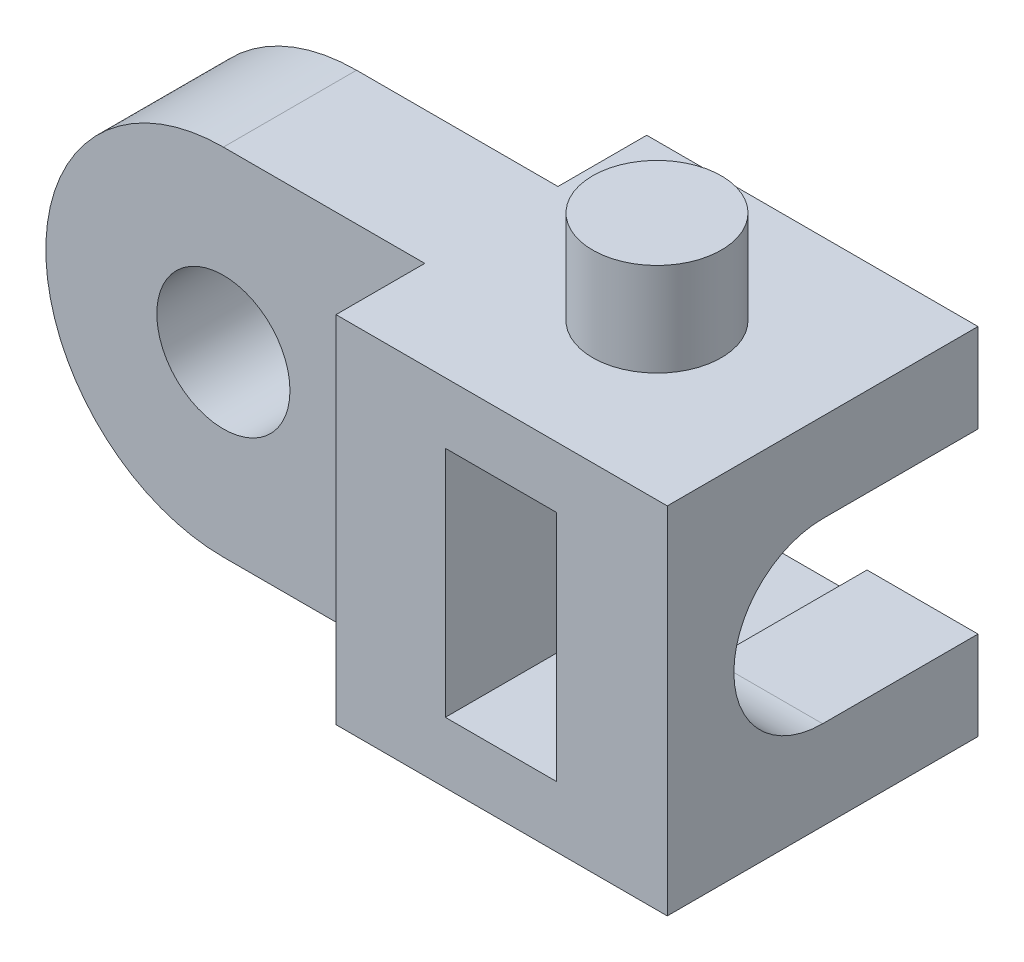
ISO-10303-21;
HEADER;
FILE_DESCRIPTION(('STEP AP214'),'2;1');
FILE_NAME('part.step','',(''),(''),'','','');
FILE_SCHEMA(('AUTOMOTIVE_DESIGN { 1 0 10303 214 1 1 1 1 }'));
ENDSEC;
DATA;
#1=APPLICATION_CONTEXT('core data for automotive mechanical design processes');
#2=APPLICATION_PROTOCOL_DEFINITION('international standard','automotive_design',2000,#1);
#3=PRODUCT_CONTEXT('',#1,'mechanical');
#4=PRODUCT('Part','Part','',(#3));
#5=PRODUCT_RELATED_PRODUCT_CATEGORY('part','',(#4));
#6=PRODUCT_DEFINITION_FORMATION('','',#4);
#7=PRODUCT_DEFINITION_CONTEXT('part definition',#1,'design');
#8=PRODUCT_DEFINITION('design','',#6,#7);
#9=PRODUCT_DEFINITION_SHAPE('','',#8);
#10=(LENGTH_UNIT() NAMED_UNIT(*) SI_UNIT(.MILLI.,.METRE.));
#11=(NAMED_UNIT(*) PLANE_ANGLE_UNIT() SI_UNIT($,.RADIAN.));
#12=(NAMED_UNIT(*) SI_UNIT($,.STERADIAN.) SOLID_ANGLE_UNIT());
#13=UNCERTAINTY_MEASURE_WITH_UNIT(LENGTH_MEASURE(1.E-05),#10,'distance_accuracy_value','');
#14=(GEOMETRIC_REPRESENTATION_CONTEXT(3) GLOBAL_UNCERTAINTY_ASSIGNED_CONTEXT((#13)) GLOBAL_UNIT_ASSIGNED_CONTEXT((#10,
#11,#12)) REPRESENTATION_CONTEXT('',''));
#15=CARTESIAN_POINT('',(0.,0.,0.));
#16=DIRECTION('',(0.,0.,1.));
#17=DIRECTION('',(1.,0.,0.));
#18=AXIS2_PLACEMENT_3D('',#15,#16,#17);
#19=CARTESIAN_POINT('',(0.,0.,-3.5));
#20=DIRECTION('',(0.,0.,1.));
#21=DIRECTION('',(1.,0.,0.));
#22=AXIS2_PLACEMENT_3D('',#19,#20,#21);
#23=PLANE('',#22);
#24=DIRECTION('',(0.,-1.,0.));
#25=VECTOR('',#24,1.);
#26=CARTESIAN_POINT('',(9.5,0.,-3.5));
#27=LINE('',#26,#25);
#28=CARTESIAN_POINT('',(9.5,-2.,-3.5));
#29=VERTEX_POINT('',#28);
#30=CARTESIAN_POINT('',(9.5,-2.625,-3.5));
#31=VERTEX_POINT('',#30);
#32=EDGE_CURVE('E265',#29,#31,#27,.T.);
#33=ORIENTED_EDGE('',*,*,#32,.F.);
#34=DIRECTION('',(-1.,0.,0.));
#35=VECTOR('',#34,1.);
#36=CARTESIAN_POINT('',(14.5,-2.,-3.5));
#37=LINE('',#36,#35);
#38=CARTESIAN_POINT('',(12.,-2.,-3.5));
#39=VERTEX_POINT('',#38);
#40=EDGE_CURVE('E167',#39,#29,#37,.T.);
#41=ORIENTED_EDGE('',*,*,#40,.F.);
#42=DIRECTION('',(0.,1.,0.));
#43=VECTOR('',#42,1.);
#44=CARTESIAN_POINT('',(12.,-4.,-3.5));
#45=LINE('',#44,#43);
#46=CARTESIAN_POINT('',(12.,-4.,-3.5));
#47=VERTEX_POINT('',#46);
#48=EDGE_CURVE('E251',#47,#39,#45,.T.);
#49=ORIENTED_EDGE('',*,*,#48,.F.);
#50=DIRECTION('',(1.,0.,0.));
#51=VECTOR('',#50,1.);
#52=CARTESIAN_POINT('',(12.,-4.,-3.5));
#53=LINE('',#52,#51);
#54=CARTESIAN_POINT('',(4.53690947743723,-4.,-3.5));
#55=VERTEX_POINT('',#54);
#56=EDGE_CURVE('E241',#55,#47,#53,.T.);
#57=ORIENTED_EDGE('',*,*,#56,.F.);
#58=DIRECTION('',(0.,-1.,0.));
#59=VECTOR('',#58,1.);
#60=CARTESIAN_POINT('',(4.53690947743723,-4.,-3.5));
#61=LINE('',#60,#59);
#62=CARTESIAN_POINT('',(4.53690947743723,4.,-3.5));
#63=VERTEX_POINT('',#62);
#64=EDGE_CURVE('E245',#63,#55,#61,.T.);
#65=ORIENTED_EDGE('',*,*,#64,.F.);
#66=DIRECTION('',(-1.,0.,0.));
#67=VECTOR('',#66,1.);
#68=CARTESIAN_POINT('',(12.,4.,-3.5));
#69=LINE('',#68,#67);
#70=CARTESIAN_POINT('',(12.,4.,-3.5));
#71=VERTEX_POINT('',#70);
#72=EDGE_CURVE('E248',#71,#63,#69,.T.);
#73=ORIENTED_EDGE('',*,*,#72,.F.);
#74=CARTESIAN_POINT('',(12.,2.,-3.5));
#75=VERTEX_POINT('',#74);
#76=EDGE_CURVE('E254',#75,#71,#45,.T.);
#77=ORIENTED_EDGE('',*,*,#76,.F.);
#78=DIRECTION('',(1.,0.,0.));
#79=VECTOR('',#78,1.);
#80=CARTESIAN_POINT('',(14.5,2.,-3.5));
#81=LINE('',#80,#79);
#82=CARTESIAN_POINT('',(9.5,2.,-3.5));
#83=VERTEX_POINT('',#82);
#84=EDGE_CURVE('E283',#83,#75,#81,.T.);
#85=ORIENTED_EDGE('',*,*,#84,.F.);
#86=CARTESIAN_POINT('',(9.5,2.625,-3.5));
#87=VERTEX_POINT('',#86);
#88=EDGE_CURVE('E176',#87,#83,#27,.T.);
#89=ORIENTED_EDGE('',*,*,#88,.F.);
#90=DIRECTION('',(1.,0.,0.));
#91=VECTOR('',#90,1.);
#92=CARTESIAN_POINT('',(0.,2.625,-3.5));
#93=LINE('',#92,#91);
#94=CARTESIAN_POINT('',(7.,2.625,-3.5));
#95=VERTEX_POINT('',#94);
#96=EDGE_CURVE('E266',#95,#87,#93,.T.);
#97=ORIENTED_EDGE('',*,*,#96,.F.);
#98=DIRECTION('',(0.,1.,0.));
#99=VECTOR('',#98,1.);
#100=CARTESIAN_POINT('',(7.,0.,-3.5));
#101=LINE('',#100,#99);
#102=CARTESIAN_POINT('',(7.,-2.625,-3.5));
#103=VERTEX_POINT('',#102);
#104=EDGE_CURVE('E268',#103,#95,#101,.T.);
#105=ORIENTED_EDGE('',*,*,#104,.F.);
#106=DIRECTION('',(-1.,0.,0.));
#107=VECTOR('',#106,1.);
#108=CARTESIAN_POINT('',(0.,-2.625,-3.5));
#109=LINE('',#108,#107);
#110=EDGE_CURVE('E270',#31,#103,#109,.T.);
#111=ORIENTED_EDGE('',*,*,#110,.F.);
#112=EDGE_LOOP('',(#33,#41,#49,#57,#65,#73,#77,#85,#89,#97,#105,#111));
#113=FACE_BOUND('',#112,.T.);
#114=ADVANCED_FACE('F49',(#113),#23,.F.);
#115=CARTESIAN_POINT('',(0.,0.,3.5));
#116=DIRECTION('',(0.,0.,1.));
#117=DIRECTION('',(1.,0.,0.));
#118=AXIS2_PLACEMENT_3D('',#115,#116,#117);
#119=PLANE('',#118);
#120=DIRECTION('',(0.,1.,0.));
#121=VECTOR('',#120,1.);
#122=CARTESIAN_POINT('',(12.,-4.,3.5));
#123=LINE('',#122,#121);
#124=CARTESIAN_POINT('',(12.,-4.,3.5));
#125=VERTEX_POINT('',#124);
#126=CARTESIAN_POINT('',(12.,4.,3.5));
#127=VERTEX_POINT('',#126);
#128=EDGE_CURVE('E244',#125,#127,#123,.T.);
#129=ORIENTED_EDGE('',*,*,#128,.T.);
#130=DIRECTION('',(-1.,0.,0.));
#131=VECTOR('',#130,1.);
#132=CARTESIAN_POINT('',(12.,4.,3.5));
#133=LINE('',#132,#131);
#134=CARTESIAN_POINT('',(4.53690947743723,4.,3.5));
#135=VERTEX_POINT('',#134);
#136=EDGE_CURVE('E260',#127,#135,#133,.T.);
#137=ORIENTED_EDGE('',*,*,#136,.T.);
#138=DIRECTION('',(0.,-1.,0.));
#139=VECTOR('',#138,1.);
#140=CARTESIAN_POINT('',(4.53690947743723,-4.,3.5));
#141=LINE('',#140,#139);
#142=CARTESIAN_POINT('',(4.53690947743723,-4.,3.5));
#143=VERTEX_POINT('',#142);
#144=EDGE_CURVE('E258',#135,#143,#141,.T.);
#145=ORIENTED_EDGE('',*,*,#144,.T.);
#146=DIRECTION('',(1.,0.,0.));
#147=VECTOR('',#146,1.);
#148=CARTESIAN_POINT('',(12.,-4.,3.5));
#149=LINE('',#148,#147);
#150=EDGE_CURVE('E255',#143,#125,#149,.T.);
#151=ORIENTED_EDGE('',*,*,#150,.T.);
#152=EDGE_LOOP('',(#129,#137,#145,#151));
#153=FACE_BOUND('',#152,.T.);
#154=DIRECTION('',(1.,0.,0.));
#155=VECTOR('',#154,1.);
#156=CARTESIAN_POINT('',(0.,2.625,3.5));
#157=LINE('',#156,#155);
#158=CARTESIAN_POINT('',(7.,2.625,3.5));
#159=VERTEX_POINT('',#158);
#160=CARTESIAN_POINT('',(9.5,2.625,3.5));
#161=VERTEX_POINT('',#160);
#162=EDGE_CURVE('E189',#159,#161,#157,.T.);
#163=ORIENTED_EDGE('',*,*,#162,.T.);
#164=DIRECTION('',(0.,-1.,0.));
#165=VECTOR('',#164,1.);
#166=CARTESIAN_POINT('',(9.5,0.,3.5));
#167=LINE('',#166,#165);
#168=CARTESIAN_POINT('',(9.5,-2.625,3.5));
#169=VERTEX_POINT('',#168);
#170=EDGE_CURVE('E57',#161,#169,#167,.T.);
#171=ORIENTED_EDGE('',*,*,#170,.T.);
#172=DIRECTION('',(-1.,0.,0.));
#173=VECTOR('',#172,1.);
#174=CARTESIAN_POINT('',(0.,-2.625,3.5));
#175=LINE('',#174,#173);
#176=CARTESIAN_POINT('',(7.,-2.625,3.5));
#177=VERTEX_POINT('',#176);
#178=EDGE_CURVE('E195',#169,#177,#175,.T.);
#179=ORIENTED_EDGE('',*,*,#178,.T.);
#180=DIRECTION('',(0.,1.,0.));
#181=VECTOR('',#180,1.);
#182=CARTESIAN_POINT('',(7.,0.,3.5));
#183=LINE('',#182,#181);
#184=EDGE_CURVE('E192',#177,#159,#183,.T.);
#185=ORIENTED_EDGE('',*,*,#184,.T.);
#186=EDGE_LOOP('',(#163,#171,#179,#185));
#187=FACE_BOUND('',#186,.T.);
#188=ADVANCED_FACE('F333',(#153,#187),#119,.T.);
#189=CARTESIAN_POINT('',(0.,0.,1.5));
#190=DIRECTION('',(0.,0.,1.));
#191=DIRECTION('',(1.,0.,0.));
#192=AXIS2_PLACEMENT_3D('',#189,#190,#191);
#193=PLANE('',#192);
#194=CARTESIAN_POINT('',(0.,0.,1.5));
#195=DIRECTION('',(0.,0.,1.));
#196=DIRECTION('',(1.,0.,0.));
#197=AXIS2_PLACEMENT_3D('',#194,#195,#196);
#198=CIRCLE('',#197,1.5);
#199=CARTESIAN_POINT('',(1.5,0.,1.5));
#200=VERTEX_POINT('',#199);
#201=EDGE_CURVE('E210',#200,#200,#198,.T.);
#202=ORIENTED_EDGE('',*,*,#201,.F.);
#203=EDGE_LOOP('',(#202));
#204=FACE_BOUND('',#203,.T.);
#205=DIRECTION('',(1.,0.,0.));
#206=VECTOR('',#205,1.);
#207=CARTESIAN_POINT('',(0.,-4.,1.5));
#208=LINE('',#207,#206);
#209=CARTESIAN_POINT('',(0.,-4.,1.5));
#210=VERTEX_POINT('',#209);
#211=CARTESIAN_POINT('',(4.53690947743723,-4.,1.5));
#212=VERTEX_POINT('',#211);
#213=EDGE_CURVE('E226',#210,#212,#208,.T.);
#214=ORIENTED_EDGE('',*,*,#213,.T.);
#215=DIRECTION('',(0.,1.,0.));
#216=VECTOR('',#215,1.);
#217=CARTESIAN_POINT('',(4.53690947743723,0.,1.5));
#218=LINE('',#217,#216);
#219=CARTESIAN_POINT('',(4.53690947743723,4.,1.5));
#220=VERTEX_POINT('',#219);
#221=EDGE_CURVE('E223',#212,#220,#218,.T.);
#222=ORIENTED_EDGE('',*,*,#221,.T.);
#223=DIRECTION('',(1.,0.,0.));
#224=VECTOR('',#223,1.);
#225=CARTESIAN_POINT('',(0.,4.,1.5));
#226=LINE('',#225,#224);
#227=CARTESIAN_POINT('',(0.,4.,1.5));
#228=VERTEX_POINT('',#227);
#229=EDGE_CURVE('E214',#228,#220,#226,.T.);
#230=ORIENTED_EDGE('',*,*,#229,.F.);
#231=CARTESIAN_POINT('',(0.,0.,1.5));
#232=DIRECTION('',(0.,0.,1.));
#233=DIRECTION('',(1.,0.,0.));
#234=AXIS2_PLACEMENT_3D('',#231,#232,#233);
#235=CIRCLE('',#234,4.);
#236=EDGE_CURVE('E228',#228,#210,#235,.T.);
#237=ORIENTED_EDGE('',*,*,#236,.T.);
#238=EDGE_LOOP('',(#214,#222,#230,#237));
#239=FACE_BOUND('',#238,.T.);
#240=ADVANCED_FACE('F324',(#204,#239),#193,.T.);
#241=CARTESIAN_POINT('',(0.,0.,-1.5));
#242=DIRECTION('',(0.,0.,1.));
#243=DIRECTION('',(1.,0.,0.));
#244=AXIS2_PLACEMENT_3D('',#241,#242,#243);
#245=PLANE('',#244);
#246=CARTESIAN_POINT('',(0.,0.,-1.5));
#247=DIRECTION('',(0.,0.,1.));
#248=DIRECTION('',(1.,0.,0.));
#249=AXIS2_PLACEMENT_3D('',#246,#247,#248);
#250=CIRCLE('',#249,1.5);
#251=CARTESIAN_POINT('',(1.5,0.,-1.5));
#252=VERTEX_POINT('',#251);
#253=EDGE_CURVE('E211',#252,#252,#250,.T.);
#254=ORIENTED_EDGE('',*,*,#253,.T.);
#255=EDGE_LOOP('',(#254));
#256=FACE_BOUND('',#255,.T.);
#257=DIRECTION('',(0.,1.,0.));
#258=VECTOR('',#257,1.);
#259=CARTESIAN_POINT('',(4.53690947743723,0.,-1.5));
#260=LINE('',#259,#258);
#261=CARTESIAN_POINT('',(4.53690947743723,-4.,-1.5));
#262=VERTEX_POINT('',#261);
#263=CARTESIAN_POINT('',(4.53690947743723,4.,-1.5));
#264=VERTEX_POINT('',#263);
#265=EDGE_CURVE('E198',#262,#264,#260,.T.);
#266=ORIENTED_EDGE('',*,*,#265,.F.);
#267=DIRECTION('',(1.,0.,0.));
#268=VECTOR('',#267,1.);
#269=CARTESIAN_POINT('',(0.,-4.,-1.5));
#270=LINE('',#269,#268);
#271=CARTESIAN_POINT('',(0.,-4.,-1.5));
#272=VERTEX_POINT('',#271);
#273=EDGE_CURVE('E215',#272,#262,#270,.T.);
#274=ORIENTED_EDGE('',*,*,#273,.F.);
#275=CARTESIAN_POINT('',(0.,0.,-1.5));
#276=DIRECTION('',(0.,0.,1.));
#277=DIRECTION('',(1.,0.,0.));
#278=AXIS2_PLACEMENT_3D('',#275,#276,#277);
#279=CIRCLE('',#278,4.);
#280=CARTESIAN_POINT('',(0.,4.,-1.5));
#281=VERTEX_POINT('',#280);
#282=EDGE_CURVE('E218',#281,#272,#279,.T.);
#283=ORIENTED_EDGE('',*,*,#282,.F.);
#284=DIRECTION('',(1.,0.,0.));
#285=VECTOR('',#284,1.);
#286=CARTESIAN_POINT('',(0.,4.,-1.5));
#287=LINE('',#286,#285);
#288=EDGE_CURVE('E220',#281,#264,#287,.T.);
#289=ORIENTED_EDGE('',*,*,#288,.T.);
#290=EDGE_LOOP('',(#266,#274,#283,#289));
#291=FACE_BOUND('',#290,.T.);
#292=ADVANCED_FACE('F304',(#256,#291),#245,.F.);
#293=CARTESIAN_POINT('',(0.,4.,1.5));
#294=DIRECTION('',(0.,1.,0.));
#295=DIRECTION('',(-1.,0.,0.));
#296=AXIS2_PLACEMENT_3D('',#293,#294,#295);
#297=PLANE('',#296);
#298=CARTESIAN_POINT('',(8.26845473871862,4.,0.));
#299=DIRECTION('',(0.,1.,0.));
#300=DIRECTION('',(-1.,0.,0.));
#301=AXIS2_PLACEMENT_3D('',#298,#299,#300);
#302=CIRCLE('',#301,1.45);
#303=CARTESIAN_POINT('',(6.81845473871862,4.,0.));
#304=VERTEX_POINT('',#303);
#305=EDGE_CURVE('E286',#304,#304,#302,.T.);
#306=ORIENTED_EDGE('',*,*,#305,.F.);
#307=EDGE_LOOP('',(#306));
#308=FACE_BOUND('',#307,.T.);
#309=DIRECTION('',(0.,0.,-1.));
#310=VECTOR('',#309,1.);
#311=CARTESIAN_POINT('',(4.53690947743723,4.,3.5));
#312=LINE('',#311,#310);
#313=EDGE_CURVE('E236',#264,#63,#312,.T.);
#314=ORIENTED_EDGE('',*,*,#313,.F.);
#315=ORIENTED_EDGE('',*,*,#288,.F.);
#316=DIRECTION('',(0.,0.,-1.));
#317=VECTOR('',#316,1.);
#318=CARTESIAN_POINT('',(0.,4.,1.5));
#319=LINE('',#318,#317);
#320=EDGE_CURVE('E200',#228,#281,#319,.T.);
#321=ORIENTED_EDGE('',*,*,#320,.F.);
#322=ORIENTED_EDGE('',*,*,#229,.T.);
#323=EDGE_CURVE('E233',#135,#220,#312,.T.);
#324=ORIENTED_EDGE('',*,*,#323,.F.);
#325=ORIENTED_EDGE('',*,*,#136,.F.);
#326=DIRECTION('',(0.,0.,-1.));
#327=VECTOR('',#326,1.);
#328=CARTESIAN_POINT('',(12.,4.,1.5));
#329=LINE('',#328,#327);
#330=EDGE_CURVE('E207',#127,#71,#329,.T.);
#331=ORIENTED_EDGE('',*,*,#330,.T.);
#332=ORIENTED_EDGE('',*,*,#72,.T.);
#333=EDGE_LOOP('',(#314,#315,#321,#322,#324,#325,#331,#332));
#334=FACE_BOUND('',#333,.T.);
#335=ADVANCED_FACE('F51',(#308,#334),#297,.T.);
#336=CARTESIAN_POINT('',(0.,0.,1.5));
#337=DIRECTION('',(0.,0.,-1.));
#338=DIRECTION('',(-1.,0.,0.));
#339=AXIS2_PLACEMENT_3D('',#336,#337,#338);
#340=CYLINDRICAL_SURFACE('',#339,4.);
#341=ORIENTED_EDGE('',*,*,#282,.T.);
#342=DIRECTION('',(0.,0.,-1.));
#343=VECTOR('',#342,1.);
#344=CARTESIAN_POINT('',(0.,-4.,1.5));
#345=LINE('',#344,#343);
#346=EDGE_CURVE('E202',#210,#272,#345,.T.);
#347=ORIENTED_EDGE('',*,*,#346,.F.);
#348=ORIENTED_EDGE('',*,*,#236,.F.);
#349=ORIENTED_EDGE('',*,*,#320,.T.);
#350=EDGE_LOOP('',(#341,#347,#348,#349));
#351=FACE_BOUND('',#350,.T.);
#352=ADVANCED_FACE('F303',(#351),#340,.T.);
#353=CARTESIAN_POINT('',(0.,-4.,1.5));
#354=DIRECTION('',(0.,1.,0.));
#355=DIRECTION('',(0.,0.,1.));
#356=AXIS2_PLACEMENT_3D('',#353,#354,#355);
#357=PLANE('',#356);
#358=DIRECTION('',(0.,0.,-1.));
#359=VECTOR('',#358,1.);
#360=CARTESIAN_POINT('',(12.,-4.,1.5));
#361=LINE('',#360,#359);
#362=EDGE_CURVE('E205',#125,#47,#361,.T.);
#363=ORIENTED_EDGE('',*,*,#362,.F.);
#364=ORIENTED_EDGE('',*,*,#150,.F.);
#365=DIRECTION('',(0.,0.,-1.));
#366=VECTOR('',#365,1.);
#367=CARTESIAN_POINT('',(4.53690947743723,-4.,3.5));
#368=LINE('',#367,#366);
#369=EDGE_CURVE('E237',#143,#212,#368,.T.);
#370=ORIENTED_EDGE('',*,*,#369,.T.);
#371=ORIENTED_EDGE('',*,*,#213,.F.);
#372=ORIENTED_EDGE('',*,*,#346,.T.);
#373=ORIENTED_EDGE('',*,*,#273,.T.);
#374=EDGE_CURVE('E240',#262,#55,#368,.T.);
#375=ORIENTED_EDGE('',*,*,#374,.T.);
#376=ORIENTED_EDGE('',*,*,#56,.T.);
#377=EDGE_LOOP('',(#363,#364,#370,#371,#372,#373,#375,#376));
#378=FACE_BOUND('',#377,.T.);
#379=ADVANCED_FACE('F319',(#378),#357,.F.);
#380=CARTESIAN_POINT('',(12.,0.,1.5));
#381=DIRECTION('',(1.,0.,0.));
#382=DIRECTION('',(0.,1.,0.));
#383=AXIS2_PLACEMENT_3D('',#380,#381,#382);
#384=PLANE('',#383);
#385=DIRECTION('',(0.,0.,-1.));
#386=VECTOR('',#385,1.);
#387=CARTESIAN_POINT('',(12.,-2.,1.5));
#388=LINE('',#387,#386);
#389=CARTESIAN_POINT('',(12.,-2.,0.));
#390=VERTEX_POINT('',#389);
#391=EDGE_CURVE('E184',#390,#39,#388,.T.);
#392=ORIENTED_EDGE('',*,*,#391,.F.);
#393=CARTESIAN_POINT('',(12.,0.,0.));
#394=DIRECTION('',(1.,0.,0.));
#395=DIRECTION('',(0.,1.,0.));
#396=AXIS2_PLACEMENT_3D('',#393,#394,#395);
#397=CIRCLE('',#396,2.);
#398=CARTESIAN_POINT('',(12.,2.,0.));
#399=VERTEX_POINT('',#398);
#400=EDGE_CURVE('E180',#399,#390,#397,.T.);
#401=ORIENTED_EDGE('',*,*,#400,.F.);
#402=DIRECTION('',(0.,0.,1.));
#403=VECTOR('',#402,1.);
#404=CARTESIAN_POINT('',(12.,2.,1.5));
#405=LINE('',#404,#403);
#406=EDGE_CURVE('E64',#75,#399,#405,.T.);
#407=ORIENTED_EDGE('',*,*,#406,.F.);
#408=ORIENTED_EDGE('',*,*,#76,.T.);
#409=ORIENTED_EDGE('',*,*,#330,.F.);
#410=ORIENTED_EDGE('',*,*,#128,.F.);
#411=ORIENTED_EDGE('',*,*,#362,.T.);
#412=ORIENTED_EDGE('',*,*,#48,.T.);
#413=EDGE_LOOP('',(#392,#401,#407,#408,#409,#410,#411,#412));
#414=FACE_BOUND('',#413,.T.);
#415=ADVANCED_FACE('F337',(#414),#384,.T.);
#416=CARTESIAN_POINT('',(0.,0.,1.5));
#417=DIRECTION('',(0.,0.,-1.));
#418=DIRECTION('',(-1.,0.,0.));
#419=AXIS2_PLACEMENT_3D('',#416,#417,#418);
#420=CYLINDRICAL_SURFACE('',#419,1.5);
#421=ORIENTED_EDGE('',*,*,#201,.T.);
#422=EDGE_LOOP('',(#421));
#423=FACE_BOUND('',#422,.T.);
#424=ORIENTED_EDGE('',*,*,#253,.F.);
#425=EDGE_LOOP('',(#424));
#426=FACE_BOUND('',#425,.T.);
#427=ADVANCED_FACE('F381',(#423,#426),#420,.F.);
#428=CARTESIAN_POINT('',(4.53690947743723,-4.,3.5));
#429=DIRECTION('',(1.,0.,0.));
#430=DIRECTION('',(0.,0.,-1.));
#431=AXIS2_PLACEMENT_3D('',#428,#429,#430);
#432=PLANE('',#431);
#433=ORIENTED_EDGE('',*,*,#374,.F.);
#434=ORIENTED_EDGE('',*,*,#265,.T.);
#435=ORIENTED_EDGE('',*,*,#313,.T.);
#436=ORIENTED_EDGE('',*,*,#64,.T.);
#437=EDGE_LOOP('',(#433,#434,#435,#436));
#438=FACE_BOUND('',#437,.T.);
#439=ADVANCED_FACE('F343',(#438),#432,.F.);
#440=ORIENTED_EDGE('',*,*,#221,.F.);
#441=ORIENTED_EDGE('',*,*,#369,.F.);
#442=ORIENTED_EDGE('',*,*,#144,.F.);
#443=ORIENTED_EDGE('',*,*,#323,.T.);
#444=EDGE_LOOP('',(#440,#441,#442,#443));
#445=FACE_BOUND('',#444,.T.);
#446=ADVANCED_FACE('F327',(#445),#432,.F.);
#447=CARTESIAN_POINT('',(9.5,2.625,8.5));
#448=DIRECTION('',(-1.,0.,0.));
#449=DIRECTION('',(0.,0.,1.));
#450=AXIS2_PLACEMENT_3D('',#447,#448,#449);
#451=PLANE('',#450);
#452=DIRECTION('',(0.,0.,-1.));
#453=VECTOR('',#452,1.);
#454=CARTESIAN_POINT('',(9.5,-2.,0.));
#455=LINE('',#454,#453);
#456=CARTESIAN_POINT('',(9.5,-2.,0.));
#457=VERTEX_POINT('',#456);
#458=EDGE_CURVE('E72',#457,#29,#455,.T.);
#459=ORIENTED_EDGE('',*,*,#458,.T.);
#460=ORIENTED_EDGE('',*,*,#32,.T.);
#461=DIRECTION('',(0.,0.,-1.));
#462=VECTOR('',#461,1.);
#463=CARTESIAN_POINT('',(9.5,-2.625,8.5));
#464=LINE('',#463,#462);
#465=EDGE_CURVE('E179',#169,#31,#464,.T.);
#466=ORIENTED_EDGE('',*,*,#465,.F.);
#467=ORIENTED_EDGE('',*,*,#170,.F.);
#468=DIRECTION('',(0.,0.,-1.));
#469=VECTOR('',#468,1.);
#470=CARTESIAN_POINT('',(9.5,2.625,8.5));
#471=LINE('',#470,#469);
#472=EDGE_CURVE('E272',#161,#87,#471,.T.);
#473=ORIENTED_EDGE('',*,*,#472,.T.);
#474=ORIENTED_EDGE('',*,*,#88,.T.);
#475=DIRECTION('',(0.,0.,-1.));
#476=VECTOR('',#475,1.);
#477=CARTESIAN_POINT('',(9.5,2.,0.));
#478=LINE('',#477,#476);
#479=CARTESIAN_POINT('',(9.5,2.,0.));
#480=VERTEX_POINT('',#479);
#481=EDGE_CURVE('E161',#480,#83,#478,.T.);
#482=ORIENTED_EDGE('',*,*,#481,.F.);
#483=CARTESIAN_POINT('',(9.5,0.,0.));
#484=DIRECTION('',(-1.,0.,0.));
#485=DIRECTION('',(0.,0.,1.));
#486=AXIS2_PLACEMENT_3D('',#483,#484,#485);
#487=CIRCLE('',#486,2.);
#488=EDGE_CURVE('E173',#457,#480,#487,.T.);
#489=ORIENTED_EDGE('',*,*,#488,.F.);
#490=EDGE_LOOP('',(#459,#460,#466,#467,#473,#474,#482,#489));
#491=FACE_BOUND('',#490,.T.);
#492=ADVANCED_FACE('F172',(#491),#451,.T.);
#493=CARTESIAN_POINT('',(7.,2.625,8.5));
#494=DIRECTION('',(0.,-1.,0.));
#495=DIRECTION('',(0.,0.,-1.));
#496=AXIS2_PLACEMENT_3D('',#493,#494,#495);
#497=PLANE('',#496);
#498=ORIENTED_EDGE('',*,*,#96,.T.);
#499=ORIENTED_EDGE('',*,*,#472,.F.);
#500=ORIENTED_EDGE('',*,*,#162,.F.);
#501=DIRECTION('',(0.,0.,-1.));
#502=VECTOR('',#501,1.);
#503=CARTESIAN_POINT('',(7.,2.625,8.5));
#504=LINE('',#503,#502);
#505=EDGE_CURVE('E274',#159,#95,#504,.T.);
#506=ORIENTED_EDGE('',*,*,#505,.T.);
#507=EDGE_LOOP('',(#498,#499,#500,#506));
#508=FACE_BOUND('',#507,.T.);
#509=ADVANCED_FACE('F357',(#508),#497,.T.);
#510=CARTESIAN_POINT('',(7.,2.625,8.5));
#511=DIRECTION('',(1.,0.,0.));
#512=DIRECTION('',(0.,0.,-1.));
#513=AXIS2_PLACEMENT_3D('',#510,#511,#512);
#514=PLANE('',#513);
#515=ORIENTED_EDGE('',*,*,#104,.T.);
#516=ORIENTED_EDGE('',*,*,#505,.F.);
#517=ORIENTED_EDGE('',*,*,#184,.F.);
#518=DIRECTION('',(0.,0.,-1.));
#519=VECTOR('',#518,1.);
#520=CARTESIAN_POINT('',(7.,-2.625,8.5));
#521=LINE('',#520,#519);
#522=EDGE_CURVE('E182',#177,#103,#521,.T.);
#523=ORIENTED_EDGE('',*,*,#522,.T.);
#524=EDGE_LOOP('',(#515,#516,#517,#523));
#525=FACE_BOUND('',#524,.T.);
#526=ADVANCED_FACE('F353',(#525),#514,.T.);
#527=CARTESIAN_POINT('',(7.,-2.625,8.5));
#528=DIRECTION('',(0.,1.,0.));
#529=DIRECTION('',(0.,0.,1.));
#530=AXIS2_PLACEMENT_3D('',#527,#528,#529);
#531=PLANE('',#530);
#532=ORIENTED_EDGE('',*,*,#110,.T.);
#533=ORIENTED_EDGE('',*,*,#522,.F.);
#534=ORIENTED_EDGE('',*,*,#178,.F.);
#535=ORIENTED_EDGE('',*,*,#465,.T.);
#536=EDGE_LOOP('',(#532,#533,#534,#535));
#537=FACE_BOUND('',#536,.T.);
#538=ADVANCED_FACE('F350',(#537),#531,.T.);
#539=CARTESIAN_POINT('',(9.,0.,0.));
#540=DIRECTION('',(1.,0.,0.));
#541=DIRECTION('',(0.,1.,0.));
#542=AXIS2_PLACEMENT_3D('',#539,#540,#541);
#543=CYLINDRICAL_SURFACE('',#542,2.);
#544=ORIENTED_EDGE('',*,*,#400,.T.);
#545=DIRECTION('',(1.,0.,0.));
#546=VECTOR('',#545,1.);
#547=CARTESIAN_POINT('',(9.,-2.,0.));
#548=LINE('',#547,#546);
#549=EDGE_CURVE('E13',#390,#457,#548,.F.);
#550=ORIENTED_EDGE('',*,*,#549,.T.);
#551=ORIENTED_EDGE('',*,*,#488,.T.);
#552=DIRECTION('',(1.,0.,0.));
#553=VECTOR('',#552,1.);
#554=CARTESIAN_POINT('',(14.5,2.,0.));
#555=LINE('',#554,#553);
#556=EDGE_CURVE('E158',#480,#399,#555,.T.);
#557=ORIENTED_EDGE('',*,*,#556,.T.);
#558=EDGE_LOOP('',(#544,#550,#551,#557));
#559=FACE_BOUND('',#558,.T.);
#560=ADVANCED_FACE('F178',(#559),#543,.F.);
#561=CARTESIAN_POINT('',(14.5,2.,0.));
#562=DIRECTION('',(0.,1.,0.));
#563=DIRECTION('',(0.,0.,1.));
#564=AXIS2_PLACEMENT_3D('',#561,#562,#563);
#565=PLANE('',#564);
#566=ORIENTED_EDGE('',*,*,#406,.T.);
#567=ORIENTED_EDGE('',*,*,#556,.F.);
#568=ORIENTED_EDGE('',*,*,#481,.T.);
#569=ORIENTED_EDGE('',*,*,#84,.T.);
#570=EDGE_LOOP('',(#566,#567,#568,#569));
#571=FACE_BOUND('',#570,.T.);
#572=ADVANCED_FACE('F160',(#571),#565,.F.);
#573=CARTESIAN_POINT('',(14.5,-2.,0.));
#574=DIRECTION('',(0.,-1.,0.));
#575=DIRECTION('',(1.,0.,0.));
#576=AXIS2_PLACEMENT_3D('',#573,#574,#575);
#577=PLANE('',#576);
#578=ORIENTED_EDGE('',*,*,#391,.T.);
#579=ORIENTED_EDGE('',*,*,#40,.T.);
#580=ORIENTED_EDGE('',*,*,#458,.F.);
#581=ORIENTED_EDGE('',*,*,#549,.F.);
#582=EDGE_LOOP('',(#578,#579,#580,#581));
#583=FACE_BOUND('',#582,.T.);
#584=ADVANCED_FACE('F297',(#583),#577,.F.);
#585=CARTESIAN_POINT('',(8.26845473871862,6.1,0.));
#586=DIRECTION('',(0.,-1.,0.));
#587=DIRECTION('',(1.,0.,0.));
#588=AXIS2_PLACEMENT_3D('',#585,#586,#587);
#589=CYLINDRICAL_SURFACE('',#588,1.45);
#590=CARTESIAN_POINT('',(8.26845473871862,6.1,0.));
#591=DIRECTION('',(0.,1.,0.));
#592=DIRECTION('',(-1.,0.,0.));
#593=AXIS2_PLACEMENT_3D('',#590,#591,#592);
#594=CIRCLE('',#593,1.45);
#595=CARTESIAN_POINT('',(6.81845473871862,6.1,0.));
#596=VERTEX_POINT('',#595);
#597=EDGE_CURVE('E284',#596,#596,#594,.T.);
#598=ORIENTED_EDGE('',*,*,#597,.F.);
#599=EDGE_LOOP('',(#598));
#600=FACE_BOUND('',#599,.T.);
#601=ORIENTED_EDGE('',*,*,#305,.T.);
#602=EDGE_LOOP('',(#601));
#603=FACE_BOUND('',#602,.T.);
#604=ADVANCED_FACE('F294',(#600,#603),#589,.T.);
#605=CARTESIAN_POINT('',(8.26845473871862,6.1,0.));
#606=DIRECTION('',(0.,1.,0.));
#607=DIRECTION('',(-1.,0.,0.));
#608=AXIS2_PLACEMENT_3D('',#605,#606,#607);
#609=PLANE('',#608);
#610=ORIENTED_EDGE('',*,*,#597,.T.);
#611=EDGE_LOOP('',(#610));
#612=FACE_BOUND('',#611,.T.);
#613=ADVANCED_FACE('F292',(#612),#609,.T.);
#614=CLOSED_SHELL('',(#114,#188,#240,#292,#335,#352,#379,#415,#427,#439,#446,#492,#509,#526,
#538,#560,#572,#584,#604,#613));
#615=MANIFOLD_SOLID_BREP('B2',#614);
#616=ADVANCED_BREP_SHAPE_REPRESENTATION('',(#18,#615),#14);
#617=SHAPE_DEFINITION_REPRESENTATION(#9,#616);
ENDSEC;
END-ISO-10303-21;
